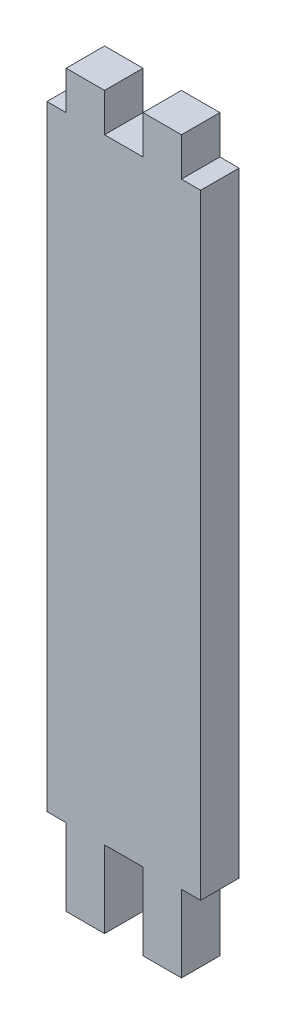
ISO-10303-21;
HEADER;
FILE_DESCRIPTION(('STEP AP214'),'2;1');
FILE_NAME('part.step','',(''),(''),'','','');
FILE_SCHEMA(('AUTOMOTIVE_DESIGN { 1 0 10303 214 1 1 1 1 }'));
ENDSEC;
DATA;
#1=APPLICATION_CONTEXT('core data for automotive mechanical design processes');
#2=APPLICATION_PROTOCOL_DEFINITION('international standard','automotive_design',2000,#1);
#3=PRODUCT_CONTEXT('',#1,'mechanical');
#4=PRODUCT('Part','Part','',(#3));
#5=PRODUCT_RELATED_PRODUCT_CATEGORY('part','',(#4));
#6=PRODUCT_DEFINITION_FORMATION('','',#4);
#7=PRODUCT_DEFINITION_CONTEXT('part definition',#1,'design');
#8=PRODUCT_DEFINITION('design','',#6,#7);
#9=PRODUCT_DEFINITION_SHAPE('','',#8);
#10=(LENGTH_UNIT() NAMED_UNIT(*) SI_UNIT(.MILLI.,.METRE.));
#11=(NAMED_UNIT(*) PLANE_ANGLE_UNIT() SI_UNIT($,.RADIAN.));
#12=(NAMED_UNIT(*) SI_UNIT($,.STERADIAN.) SOLID_ANGLE_UNIT());
#13=UNCERTAINTY_MEASURE_WITH_UNIT(LENGTH_MEASURE(1.E-05),#10,'distance_accuracy_value','');
#14=(GEOMETRIC_REPRESENTATION_CONTEXT(3) GLOBAL_UNCERTAINTY_ASSIGNED_CONTEXT((#13)) GLOBAL_UNIT_ASSIGNED_CONTEXT((#10,
#11,#12)) REPRESENTATION_CONTEXT('',''));
#15=CARTESIAN_POINT('',(0.,0.,0.));
#16=DIRECTION('',(0.,0.,1.));
#17=DIRECTION('',(1.,0.,0.));
#18=AXIS2_PLACEMENT_3D('',#15,#16,#17);
#19=CARTESIAN_POINT('',(7.5,40.,5.));
#20=DIRECTION('',(0.,-1.,0.));
#21=DIRECTION('',(0.,0.,-1.));
#22=AXIS2_PLACEMENT_3D('',#19,#20,#21);
#23=PLANE('',#22);
#24=DIRECTION('',(-1.,0.,0.));
#25=VECTOR('',#24,1.);
#26=CARTESIAN_POINT('',(7.5,40.,0.));
#27=LINE('',#26,#25);
#28=CARTESIAN_POINT('',(10.,40.,0.));
#29=VERTEX_POINT('',#28);
#30=CARTESIAN_POINT('',(7.5,40.,0.));
#31=VERTEX_POINT('',#30);
#32=EDGE_CURVE('E201',#29,#31,#27,.T.);
#33=ORIENTED_EDGE('',*,*,#32,.T.);
#34=DIRECTION('',(0.,0.,-1.));
#35=VECTOR('',#34,1.);
#36=CARTESIAN_POINT('',(7.5,40.,5.));
#37=LINE('',#36,#35);
#38=CARTESIAN_POINT('',(7.5,40.,5.));
#39=VERTEX_POINT('',#38);
#40=EDGE_CURVE('E11',#39,#31,#37,.T.);
#41=ORIENTED_EDGE('',*,*,#40,.F.);
#42=DIRECTION('',(-1.,0.,0.));
#43=VECTOR('',#42,1.);
#44=CARTESIAN_POINT('',(7.5,40.,5.));
#45=LINE('',#44,#43);
#46=CARTESIAN_POINT('',(10.,40.,5.));
#47=VERTEX_POINT('',#46);
#48=EDGE_CURVE('E241',#47,#39,#45,.T.);
#49=ORIENTED_EDGE('',*,*,#48,.F.);
#50=DIRECTION('',(0.,0.,-1.));
#51=VECTOR('',#50,1.);
#52=CARTESIAN_POINT('',(10.,40.,5.));
#53=LINE('',#52,#51);
#54=EDGE_CURVE('E197',#47,#29,#53,.T.);
#55=ORIENTED_EDGE('',*,*,#54,.T.);
#56=EDGE_LOOP('',(#33,#41,#49,#55));
#57=FACE_BOUND('',#56,.T.);
#58=ADVANCED_FACE('F33',(#57),#23,.F.);
#59=CARTESIAN_POINT('',(7.5,45.,5.));
#60=DIRECTION('',(-1.,0.,0.));
#61=DIRECTION('',(0.,0.,1.));
#62=AXIS2_PLACEMENT_3D('',#59,#60,#61);
#63=PLANE('',#62);
#64=DIRECTION('',(0.,1.,0.));
#65=VECTOR('',#64,1.);
#66=CARTESIAN_POINT('',(7.5,45.,0.));
#67=LINE('',#66,#65);
#68=CARTESIAN_POINT('',(7.5,45.,0.));
#69=VERTEX_POINT('',#68);
#70=EDGE_CURVE('E204',#31,#69,#67,.T.);
#71=ORIENTED_EDGE('',*,*,#70,.T.);
#72=DIRECTION('',(0.,0.,-1.));
#73=VECTOR('',#72,1.);
#74=CARTESIAN_POINT('',(7.5,45.,5.));
#75=LINE('',#74,#73);
#76=CARTESIAN_POINT('',(7.5,45.,5.));
#77=VERTEX_POINT('',#76);
#78=EDGE_CURVE('E41',#77,#69,#75,.T.);
#79=ORIENTED_EDGE('',*,*,#78,.F.);
#80=DIRECTION('',(0.,1.,0.));
#81=VECTOR('',#80,1.);
#82=CARTESIAN_POINT('',(7.5,45.,5.));
#83=LINE('',#82,#81);
#84=EDGE_CURVE('E128',#39,#77,#83,.T.);
#85=ORIENTED_EDGE('',*,*,#84,.F.);
#86=ORIENTED_EDGE('',*,*,#40,.T.);
#87=EDGE_LOOP('',(#71,#79,#85,#86));
#88=FACE_BOUND('',#87,.T.);
#89=ADVANCED_FACE('F358',(#88),#63,.F.);
#90=CARTESIAN_POINT('',(2.5,45.,5.));
#91=DIRECTION('',(0.,-1.,0.));
#92=DIRECTION('',(1.,0.,0.));
#93=AXIS2_PLACEMENT_3D('',#90,#91,#92);
#94=PLANE('',#93);
#95=DIRECTION('',(-1.,0.,0.));
#96=VECTOR('',#95,1.);
#97=CARTESIAN_POINT('',(2.5,45.,0.));
#98=LINE('',#97,#96);
#99=CARTESIAN_POINT('',(2.5,45.,0.));
#100=VERTEX_POINT('',#99);
#101=EDGE_CURVE('E206',#69,#100,#98,.T.);
#102=ORIENTED_EDGE('',*,*,#101,.T.);
#103=DIRECTION('',(0.,0.,-1.));
#104=VECTOR('',#103,1.);
#105=CARTESIAN_POINT('',(2.5,45.,5.));
#106=LINE('',#105,#104);
#107=CARTESIAN_POINT('',(2.5,45.,5.));
#108=VERTEX_POINT('',#107);
#109=EDGE_CURVE('E284',#108,#100,#106,.T.);
#110=ORIENTED_EDGE('',*,*,#109,.F.);
#111=DIRECTION('',(-1.,0.,0.));
#112=VECTOR('',#111,1.);
#113=CARTESIAN_POINT('',(2.5,45.,5.));
#114=LINE('',#113,#112);
#115=EDGE_CURVE('E292',#77,#108,#114,.T.);
#116=ORIENTED_EDGE('',*,*,#115,.F.);
#117=ORIENTED_EDGE('',*,*,#78,.T.);
#118=EDGE_LOOP('',(#102,#110,#116,#117));
#119=FACE_BOUND('',#118,.T.);
#120=ADVANCED_FACE('F290',(#119),#94,.F.);
#121=CARTESIAN_POINT('',(2.5,40.,5.));
#122=DIRECTION('',(1.,0.,0.));
#123=DIRECTION('',(0.,0.,-1.));
#124=AXIS2_PLACEMENT_3D('',#121,#122,#123);
#125=PLANE('',#124);
#126=DIRECTION('',(0.,-1.,0.));
#127=VECTOR('',#126,1.);
#128=CARTESIAN_POINT('',(2.5,40.,0.));
#129=LINE('',#128,#127);
#130=CARTESIAN_POINT('',(2.5,40.,0.));
#131=VERTEX_POINT('',#130);
#132=EDGE_CURVE('E208',#100,#131,#129,.T.);
#133=ORIENTED_EDGE('',*,*,#132,.T.);
#134=DIRECTION('',(0.,0.,-1.));
#135=VECTOR('',#134,1.);
#136=CARTESIAN_POINT('',(2.5,40.,5.));
#137=LINE('',#136,#135);
#138=CARTESIAN_POINT('',(2.5,40.,5.));
#139=VERTEX_POINT('',#138);
#140=EDGE_CURVE('E281',#139,#131,#137,.T.);
#141=ORIENTED_EDGE('',*,*,#140,.F.);
#142=DIRECTION('',(0.,-1.,0.));
#143=VECTOR('',#142,1.);
#144=CARTESIAN_POINT('',(2.5,40.,5.));
#145=LINE('',#144,#143);
#146=EDGE_CURVE('E310',#108,#139,#145,.T.);
#147=ORIENTED_EDGE('',*,*,#146,.F.);
#148=ORIENTED_EDGE('',*,*,#109,.T.);
#149=EDGE_LOOP('',(#133,#141,#147,#148));
#150=FACE_BOUND('',#149,.T.);
#151=ADVANCED_FACE('F301',(#150),#125,.F.);
#152=CARTESIAN_POINT('',(-2.5,40.,5.));
#153=DIRECTION('',(0.,-1.,0.));
#154=DIRECTION('',(0.,0.,-1.));
#155=AXIS2_PLACEMENT_3D('',#152,#153,#154);
#156=PLANE('',#155);
#157=DIRECTION('',(-1.,0.,0.));
#158=VECTOR('',#157,1.);
#159=CARTESIAN_POINT('',(-2.5,40.,0.));
#160=LINE('',#159,#158);
#161=CARTESIAN_POINT('',(-2.5,40.,0.));
#162=VERTEX_POINT('',#161);
#163=EDGE_CURVE('E210',#131,#162,#160,.T.);
#164=ORIENTED_EDGE('',*,*,#163,.T.);
#165=DIRECTION('',(0.,0.,-1.));
#166=VECTOR('',#165,1.);
#167=CARTESIAN_POINT('',(-2.5,40.,5.));
#168=LINE('',#167,#166);
#169=CARTESIAN_POINT('',(-2.5,40.,5.));
#170=VERTEX_POINT('',#169);
#171=EDGE_CURVE('E278',#170,#162,#168,.T.);
#172=ORIENTED_EDGE('',*,*,#171,.F.);
#173=DIRECTION('',(-1.,0.,0.));
#174=VECTOR('',#173,1.);
#175=CARTESIAN_POINT('',(-2.5,40.,5.));
#176=LINE('',#175,#174);
#177=EDGE_CURVE('E307',#139,#170,#176,.T.);
#178=ORIENTED_EDGE('',*,*,#177,.F.);
#179=ORIENTED_EDGE('',*,*,#140,.T.);
#180=EDGE_LOOP('',(#164,#172,#178,#179));
#181=FACE_BOUND('',#180,.T.);
#182=ADVANCED_FACE('F305',(#181),#156,.F.);
#183=CARTESIAN_POINT('',(-2.5,45.,5.));
#184=DIRECTION('',(-1.,0.,0.));
#185=DIRECTION('',(0.,0.,1.));
#186=AXIS2_PLACEMENT_3D('',#183,#184,#185);
#187=PLANE('',#186);
#188=DIRECTION('',(0.,1.,0.));
#189=VECTOR('',#188,1.);
#190=CARTESIAN_POINT('',(-2.5,45.,0.));
#191=LINE('',#190,#189);
#192=CARTESIAN_POINT('',(-2.5,45.,0.));
#193=VERTEX_POINT('',#192);
#194=EDGE_CURVE('E212',#162,#193,#191,.T.);
#195=ORIENTED_EDGE('',*,*,#194,.T.);
#196=DIRECTION('',(0.,0.,-1.));
#197=VECTOR('',#196,1.);
#198=CARTESIAN_POINT('',(-2.5,45.,5.));
#199=LINE('',#198,#197);
#200=CARTESIAN_POINT('',(-2.5,45.,5.));
#201=VERTEX_POINT('',#200);
#202=EDGE_CURVE('E275',#201,#193,#199,.T.);
#203=ORIENTED_EDGE('',*,*,#202,.F.);
#204=DIRECTION('',(0.,1.,0.));
#205=VECTOR('',#204,1.);
#206=CARTESIAN_POINT('',(-2.5,45.,5.));
#207=LINE('',#206,#205);
#208=EDGE_CURVE('E309',#170,#201,#207,.T.);
#209=ORIENTED_EDGE('',*,*,#208,.F.);
#210=ORIENTED_EDGE('',*,*,#171,.T.);
#211=EDGE_LOOP('',(#195,#203,#209,#210));
#212=FACE_BOUND('',#211,.T.);
#213=ADVANCED_FACE('F371',(#212),#187,.F.);
#214=CARTESIAN_POINT('',(-7.5,45.,5.));
#215=DIRECTION('',(0.,-1.,0.));
#216=DIRECTION('',(0.,0.,-1.));
#217=AXIS2_PLACEMENT_3D('',#214,#215,#216);
#218=PLANE('',#217);
#219=DIRECTION('',(-1.,0.,0.));
#220=VECTOR('',#219,1.);
#221=CARTESIAN_POINT('',(-7.5,45.,0.));
#222=LINE('',#221,#220);
#223=CARTESIAN_POINT('',(-7.5,45.,0.));
#224=VERTEX_POINT('',#223);
#225=EDGE_CURVE('E214',#193,#224,#222,.T.);
#226=ORIENTED_EDGE('',*,*,#225,.T.);
#227=DIRECTION('',(0.,0.,-1.));
#228=VECTOR('',#227,1.);
#229=CARTESIAN_POINT('',(-7.5,45.,5.));
#230=LINE('',#229,#228);
#231=CARTESIAN_POINT('',(-7.5,45.,5.));
#232=VERTEX_POINT('',#231);
#233=EDGE_CURVE('E272',#232,#224,#230,.T.);
#234=ORIENTED_EDGE('',*,*,#233,.F.);
#235=DIRECTION('',(-1.,0.,0.));
#236=VECTOR('',#235,1.);
#237=CARTESIAN_POINT('',(-7.5,45.,5.));
#238=LINE('',#237,#236);
#239=EDGE_CURVE('E312',#201,#232,#238,.T.);
#240=ORIENTED_EDGE('',*,*,#239,.F.);
#241=ORIENTED_EDGE('',*,*,#202,.T.);
#242=EDGE_LOOP('',(#226,#234,#240,#241));
#243=FACE_BOUND('',#242,.T.);
#244=ADVANCED_FACE('F374',(#243),#218,.F.);
#245=CARTESIAN_POINT('',(-7.5,40.,5.));
#246=DIRECTION('',(1.,0.,0.));
#247=DIRECTION('',(0.,0.,-1.));
#248=AXIS2_PLACEMENT_3D('',#245,#246,#247);
#249=PLANE('',#248);
#250=DIRECTION('',(0.,-1.,0.));
#251=VECTOR('',#250,1.);
#252=CARTESIAN_POINT('',(-7.5,40.,0.));
#253=LINE('',#252,#251);
#254=CARTESIAN_POINT('',(-7.5,40.,0.));
#255=VERTEX_POINT('',#254);
#256=EDGE_CURVE('E216',#224,#255,#253,.T.);
#257=ORIENTED_EDGE('',*,*,#256,.T.);
#258=DIRECTION('',(0.,0.,-1.));
#259=VECTOR('',#258,1.);
#260=CARTESIAN_POINT('',(-7.5,40.,5.));
#261=LINE('',#260,#259);
#262=CARTESIAN_POINT('',(-7.5,40.,5.));
#263=VERTEX_POINT('',#262);
#264=EDGE_CURVE('E269',#263,#255,#261,.T.);
#265=ORIENTED_EDGE('',*,*,#264,.F.);
#266=DIRECTION('',(0.,-1.,0.));
#267=VECTOR('',#266,1.);
#268=CARTESIAN_POINT('',(-7.5,40.,5.));
#269=LINE('',#268,#267);
#270=EDGE_CURVE('E318',#232,#263,#269,.T.);
#271=ORIENTED_EDGE('',*,*,#270,.F.);
#272=ORIENTED_EDGE('',*,*,#233,.T.);
#273=EDGE_LOOP('',(#257,#265,#271,#272));
#274=FACE_BOUND('',#273,.T.);
#275=ADVANCED_FACE('F378',(#274),#249,.F.);
#276=CARTESIAN_POINT('',(-10.,40.,5.));
#277=DIRECTION('',(0.,-1.,0.));
#278=DIRECTION('',(0.,0.,-1.));
#279=AXIS2_PLACEMENT_3D('',#276,#277,#278);
#280=PLANE('',#279);
#281=DIRECTION('',(-1.,0.,0.));
#282=VECTOR('',#281,1.);
#283=CARTESIAN_POINT('',(-10.,40.,0.));
#284=LINE('',#283,#282);
#285=CARTESIAN_POINT('',(-10.,40.,0.));
#286=VERTEX_POINT('',#285);
#287=EDGE_CURVE('E218',#255,#286,#284,.T.);
#288=ORIENTED_EDGE('',*,*,#287,.T.);
#289=DIRECTION('',(0.,0.,-1.));
#290=VECTOR('',#289,1.);
#291=CARTESIAN_POINT('',(-10.,40.,5.));
#292=LINE('',#291,#290);
#293=CARTESIAN_POINT('',(-10.,40.,5.));
#294=VERTEX_POINT('',#293);
#295=EDGE_CURVE('E266',#294,#286,#292,.T.);
#296=ORIENTED_EDGE('',*,*,#295,.F.);
#297=DIRECTION('',(-1.,0.,0.));
#298=VECTOR('',#297,1.);
#299=CARTESIAN_POINT('',(-10.,40.,5.));
#300=LINE('',#299,#298);
#301=EDGE_CURVE('E320',#263,#294,#300,.T.);
#302=ORIENTED_EDGE('',*,*,#301,.F.);
#303=ORIENTED_EDGE('',*,*,#264,.T.);
#304=EDGE_LOOP('',(#288,#296,#302,#303));
#305=FACE_BOUND('',#304,.T.);
#306=ADVANCED_FACE('F382',(#305),#280,.F.);
#307=CARTESIAN_POINT('',(-10.,-40.,5.));
#308=DIRECTION('',(1.,0.,0.));
#309=DIRECTION('',(0.,0.,-1.));
#310=AXIS2_PLACEMENT_3D('',#307,#308,#309);
#311=PLANE('',#310);
#312=DIRECTION('',(0.,-1.,0.));
#313=VECTOR('',#312,1.);
#314=CARTESIAN_POINT('',(-10.,-40.,0.));
#315=LINE('',#314,#313);
#316=CARTESIAN_POINT('',(-10.,-40.,0.));
#317=VERTEX_POINT('',#316);
#318=EDGE_CURVE('E220',#286,#317,#315,.T.);
#319=ORIENTED_EDGE('',*,*,#318,.T.);
#320=DIRECTION('',(0.,0.,-1.));
#321=VECTOR('',#320,1.);
#322=CARTESIAN_POINT('',(-10.,-40.,5.));
#323=LINE('',#322,#321);
#324=CARTESIAN_POINT('',(-10.,-40.,5.));
#325=VERTEX_POINT('',#324);
#326=EDGE_CURVE('E263',#325,#317,#323,.T.);
#327=ORIENTED_EDGE('',*,*,#326,.F.);
#328=DIRECTION('',(0.,-1.,0.));
#329=VECTOR('',#328,1.);
#330=CARTESIAN_POINT('',(-10.,-40.,5.));
#331=LINE('',#330,#329);
#332=EDGE_CURVE('E322',#294,#325,#331,.T.);
#333=ORIENTED_EDGE('',*,*,#332,.F.);
#334=ORIENTED_EDGE('',*,*,#295,.T.);
#335=EDGE_LOOP('',(#319,#327,#333,#334));
#336=FACE_BOUND('',#335,.T.);
#337=ADVANCED_FACE('F386',(#336),#311,.F.);
#338=CARTESIAN_POINT('',(-10.,-40.,5.));
#339=DIRECTION('',(0.,1.,0.));
#340=DIRECTION('',(0.,0.,1.));
#341=AXIS2_PLACEMENT_3D('',#338,#339,#340);
#342=PLANE('',#341);
#343=DIRECTION('',(1.,0.,0.));
#344=VECTOR('',#343,1.);
#345=CARTESIAN_POINT('',(-10.,-40.,0.));
#346=LINE('',#345,#344);
#347=CARTESIAN_POINT('',(-7.5,-40.,0.));
#348=VERTEX_POINT('',#347);
#349=EDGE_CURVE('E222',#317,#348,#346,.T.);
#350=ORIENTED_EDGE('',*,*,#349,.T.);
#351=DIRECTION('',(0.,0.,-1.));
#352=VECTOR('',#351,1.);
#353=CARTESIAN_POINT('',(-7.5,-40.,5.));
#354=LINE('',#353,#352);
#355=CARTESIAN_POINT('',(-7.5,-40.,5.));
#356=VERTEX_POINT('',#355);
#357=EDGE_CURVE('E260',#356,#348,#354,.T.);
#358=ORIENTED_EDGE('',*,*,#357,.F.);
#359=DIRECTION('',(1.,0.,0.));
#360=VECTOR('',#359,1.);
#361=CARTESIAN_POINT('',(-10.,-40.,5.));
#362=LINE('',#361,#360);
#363=EDGE_CURVE('E324',#325,#356,#362,.T.);
#364=ORIENTED_EDGE('',*,*,#363,.F.);
#365=ORIENTED_EDGE('',*,*,#326,.T.);
#366=EDGE_LOOP('',(#350,#358,#364,#365));
#367=FACE_BOUND('',#366,.T.);
#368=ADVANCED_FACE('F390',(#367),#342,.F.);
#369=CARTESIAN_POINT('',(-7.5,-45.,5.));
#370=DIRECTION('',(1.,0.,0.));
#371=DIRECTION('',(0.,0.,-1.));
#372=AXIS2_PLACEMENT_3D('',#369,#370,#371);
#373=PLANE('',#372);
#374=DIRECTION('',(0.,-1.,0.));
#375=VECTOR('',#374,1.);
#376=CARTESIAN_POINT('',(-7.5,-45.,0.));
#377=LINE('',#376,#375);
#378=CARTESIAN_POINT('',(-7.5,-50.,0.));
#379=VERTEX_POINT('',#378);
#380=EDGE_CURVE('E225',#348,#379,#377,.T.);
#381=ORIENTED_EDGE('',*,*,#380,.T.);
#382=DIRECTION('',(0.,0.,-1.));
#383=VECTOR('',#382,1.);
#384=CARTESIAN_POINT('',(-7.5,-50.,5.));
#385=LINE('',#384,#383);
#386=CARTESIAN_POINT('',(-7.5,-50.,5.));
#387=VERTEX_POINT('',#386);
#388=EDGE_CURVE('E257',#387,#379,#385,.T.);
#389=ORIENTED_EDGE('',*,*,#388,.F.);
#390=DIRECTION('',(0.,-1.,0.));
#391=VECTOR('',#390,1.);
#392=CARTESIAN_POINT('',(-7.5,-40.,5.));
#393=LINE('',#392,#391);
#394=EDGE_CURVE('E326',#356,#387,#393,.T.);
#395=ORIENTED_EDGE('',*,*,#394,.F.);
#396=ORIENTED_EDGE('',*,*,#357,.T.);
#397=EDGE_LOOP('',(#381,#389,#395,#396));
#398=FACE_BOUND('',#397,.T.);
#399=ADVANCED_FACE('F394',(#398),#373,.F.);
#400=CARTESIAN_POINT('',(-7.5,-50.,5.));
#401=DIRECTION('',(0.,1.,0.));
#402=DIRECTION('',(0.,0.,1.));
#403=AXIS2_PLACEMENT_3D('',#400,#401,#402);
#404=PLANE('',#403);
#405=DIRECTION('',(1.,0.,0.));
#406=VECTOR('',#405,1.);
#407=CARTESIAN_POINT('',(-7.5,-50.,0.));
#408=LINE('',#407,#406);
#409=CARTESIAN_POINT('',(-2.5,-50.,0.));
#410=VERTEX_POINT('',#409);
#411=EDGE_CURVE('E227',#379,#410,#408,.T.);
#412=ORIENTED_EDGE('',*,*,#411,.T.);
#413=DIRECTION('',(0.,0.,-1.));
#414=VECTOR('',#413,1.);
#415=CARTESIAN_POINT('',(-2.5,-50.,5.));
#416=LINE('',#415,#414);
#417=CARTESIAN_POINT('',(-2.5,-50.,5.));
#418=VERTEX_POINT('',#417);
#419=EDGE_CURVE('E254',#418,#410,#416,.T.);
#420=ORIENTED_EDGE('',*,*,#419,.F.);
#421=DIRECTION('',(1.,0.,0.));
#422=VECTOR('',#421,1.);
#423=CARTESIAN_POINT('',(-7.5,-50.,5.));
#424=LINE('',#423,#422);
#425=EDGE_CURVE('E328',#387,#418,#424,.T.);
#426=ORIENTED_EDGE('',*,*,#425,.F.);
#427=ORIENTED_EDGE('',*,*,#388,.T.);
#428=EDGE_LOOP('',(#412,#420,#426,#427));
#429=FACE_BOUND('',#428,.T.);
#430=ADVANCED_FACE('F398',(#429),#404,.F.);
#431=CARTESIAN_POINT('',(-2.5,-50.,5.));
#432=DIRECTION('',(-1.,0.,0.));
#433=DIRECTION('',(0.,-1.,0.));
#434=AXIS2_PLACEMENT_3D('',#431,#432,#433);
#435=PLANE('',#434);
#436=DIRECTION('',(0.,1.,0.));
#437=VECTOR('',#436,1.);
#438=CARTESIAN_POINT('',(-2.5,-50.,0.));
#439=LINE('',#438,#437);
#440=CARTESIAN_POINT('',(-2.5,-40.,0.));
#441=VERTEX_POINT('',#440);
#442=EDGE_CURVE('E229',#410,#441,#439,.T.);
#443=ORIENTED_EDGE('',*,*,#442,.T.);
#444=DIRECTION('',(0.,0.,-1.));
#445=VECTOR('',#444,1.);
#446=CARTESIAN_POINT('',(-2.5,-40.,5.));
#447=LINE('',#446,#445);
#448=CARTESIAN_POINT('',(-2.5,-40.,5.));
#449=VERTEX_POINT('',#448);
#450=EDGE_CURVE('E251',#449,#441,#447,.T.);
#451=ORIENTED_EDGE('',*,*,#450,.F.);
#452=DIRECTION('',(0.,1.,0.));
#453=VECTOR('',#452,1.);
#454=CARTESIAN_POINT('',(-2.5,-50.,5.));
#455=LINE('',#454,#453);
#456=EDGE_CURVE('E330',#418,#449,#455,.T.);
#457=ORIENTED_EDGE('',*,*,#456,.F.);
#458=ORIENTED_EDGE('',*,*,#419,.T.);
#459=EDGE_LOOP('',(#443,#451,#457,#458));
#460=FACE_BOUND('',#459,.T.);
#461=ADVANCED_FACE('F402',(#460),#435,.F.);
#462=CARTESIAN_POINT('',(-2.5,-40.,5.));
#463=DIRECTION('',(0.,1.,0.));
#464=DIRECTION('',(0.,0.,1.));
#465=AXIS2_PLACEMENT_3D('',#462,#463,#464);
#466=PLANE('',#465);
#467=DIRECTION('',(1.,0.,0.));
#468=VECTOR('',#467,1.);
#469=CARTESIAN_POINT('',(-2.5,-40.,0.));
#470=LINE('',#469,#468);
#471=CARTESIAN_POINT('',(2.5,-40.,0.));
#472=VERTEX_POINT('',#471);
#473=EDGE_CURVE('E231',#441,#472,#470,.T.);
#474=ORIENTED_EDGE('',*,*,#473,.T.);
#475=DIRECTION('',(0.,0.,-1.));
#476=VECTOR('',#475,1.);
#477=CARTESIAN_POINT('',(2.5,-40.,5.));
#478=LINE('',#477,#476);
#479=CARTESIAN_POINT('',(2.5,-40.,5.));
#480=VERTEX_POINT('',#479);
#481=EDGE_CURVE('E248',#480,#472,#478,.T.);
#482=ORIENTED_EDGE('',*,*,#481,.F.);
#483=DIRECTION('',(1.,0.,0.));
#484=VECTOR('',#483,1.);
#485=CARTESIAN_POINT('',(-2.5,-40.,5.));
#486=LINE('',#485,#484);
#487=EDGE_CURVE('E332',#449,#480,#486,.T.);
#488=ORIENTED_EDGE('',*,*,#487,.F.);
#489=ORIENTED_EDGE('',*,*,#450,.T.);
#490=EDGE_LOOP('',(#474,#482,#488,#489));
#491=FACE_BOUND('',#490,.T.);
#492=ADVANCED_FACE('F406',(#491),#466,.F.);
#493=CARTESIAN_POINT('',(2.5,-45.,5.));
#494=DIRECTION('',(1.,0.,0.));
#495=DIRECTION('',(0.,1.,0.));
#496=AXIS2_PLACEMENT_3D('',#493,#494,#495);
#497=PLANE('',#496);
#498=DIRECTION('',(0.,-1.,0.));
#499=VECTOR('',#498,1.);
#500=CARTESIAN_POINT('',(2.5,-45.,0.));
#501=LINE('',#500,#499);
#502=CARTESIAN_POINT('',(2.5,-50.,0.));
#503=VERTEX_POINT('',#502);
#504=EDGE_CURVE('E234',#472,#503,#501,.T.);
#505=ORIENTED_EDGE('',*,*,#504,.T.);
#506=DIRECTION('',(0.,0.,-1.));
#507=VECTOR('',#506,1.);
#508=CARTESIAN_POINT('',(2.5,-50.,5.));
#509=LINE('',#508,#507);
#510=CARTESIAN_POINT('',(2.5,-50.,5.));
#511=VERTEX_POINT('',#510);
#512=EDGE_CURVE('E245',#511,#503,#509,.T.);
#513=ORIENTED_EDGE('',*,*,#512,.F.);
#514=DIRECTION('',(0.,-1.,0.));
#515=VECTOR('',#514,1.);
#516=CARTESIAN_POINT('',(2.5,-40.,5.));
#517=LINE('',#516,#515);
#518=EDGE_CURVE('E334',#480,#511,#517,.T.);
#519=ORIENTED_EDGE('',*,*,#518,.F.);
#520=ORIENTED_EDGE('',*,*,#481,.T.);
#521=EDGE_LOOP('',(#505,#513,#519,#520));
#522=FACE_BOUND('',#521,.T.);
#523=ADVANCED_FACE('F340',(#522),#497,.F.);
#524=CARTESIAN_POINT('',(2.5,-50.,5.));
#525=DIRECTION('',(0.,1.,0.));
#526=DIRECTION('',(0.,0.,1.));
#527=AXIS2_PLACEMENT_3D('',#524,#525,#526);
#528=PLANE('',#527);
#529=DIRECTION('',(1.,0.,0.));
#530=VECTOR('',#529,1.);
#531=CARTESIAN_POINT('',(2.5,-50.,0.));
#532=LINE('',#531,#530);
#533=CARTESIAN_POINT('',(7.5,-50.,0.));
#534=VERTEX_POINT('',#533);
#535=EDGE_CURVE('E236',#503,#534,#532,.T.);
#536=ORIENTED_EDGE('',*,*,#535,.T.);
#537=DIRECTION('',(0.,0.,-1.));
#538=VECTOR('',#537,1.);
#539=CARTESIAN_POINT('',(7.5,-50.,5.));
#540=LINE('',#539,#538);
#541=CARTESIAN_POINT('',(7.5,-50.,5.));
#542=VERTEX_POINT('',#541);
#543=EDGE_CURVE('E192',#542,#534,#540,.T.);
#544=ORIENTED_EDGE('',*,*,#543,.F.);
#545=DIRECTION('',(1.,0.,0.));
#546=VECTOR('',#545,1.);
#547=CARTESIAN_POINT('',(2.5,-50.,5.));
#548=LINE('',#547,#546);
#549=EDGE_CURVE('E183',#511,#542,#548,.T.);
#550=ORIENTED_EDGE('',*,*,#549,.F.);
#551=ORIENTED_EDGE('',*,*,#512,.T.);
#552=EDGE_LOOP('',(#536,#544,#550,#551));
#553=FACE_BOUND('',#552,.T.);
#554=ADVANCED_FACE('F343',(#553),#528,.F.);
#555=CARTESIAN_POINT('',(7.5,-50.,5.));
#556=DIRECTION('',(-1.,0.,0.));
#557=DIRECTION('',(0.,0.,1.));
#558=AXIS2_PLACEMENT_3D('',#555,#556,#557);
#559=PLANE('',#558);
#560=DIRECTION('',(0.,1.,0.));
#561=VECTOR('',#560,1.);
#562=CARTESIAN_POINT('',(7.5,-50.,0.));
#563=LINE('',#562,#561);
#564=CARTESIAN_POINT('',(7.5,-40.,0.));
#565=VERTEX_POINT('',#564);
#566=EDGE_CURVE('E191',#534,#565,#563,.T.);
#567=ORIENTED_EDGE('',*,*,#566,.T.);
#568=DIRECTION('',(0.,0.,-1.));
#569=VECTOR('',#568,1.);
#570=CARTESIAN_POINT('',(7.5,-40.,5.));
#571=LINE('',#570,#569);
#572=CARTESIAN_POINT('',(7.5,-40.,5.));
#573=VERTEX_POINT('',#572);
#574=EDGE_CURVE('E188',#573,#565,#571,.T.);
#575=ORIENTED_EDGE('',*,*,#574,.F.);
#576=DIRECTION('',(0.,1.,0.));
#577=VECTOR('',#576,1.);
#578=CARTESIAN_POINT('',(7.5,-50.,5.));
#579=LINE('',#578,#577);
#580=EDGE_CURVE('E177',#542,#573,#579,.T.);
#581=ORIENTED_EDGE('',*,*,#580,.F.);
#582=ORIENTED_EDGE('',*,*,#543,.T.);
#583=EDGE_LOOP('',(#567,#575,#581,#582));
#584=FACE_BOUND('',#583,.T.);
#585=ADVANCED_FACE('F189',(#584),#559,.F.);
#586=CARTESIAN_POINT('',(7.5,-40.,5.));
#587=DIRECTION('',(0.,1.,0.));
#588=DIRECTION('',(0.,0.,1.));
#589=AXIS2_PLACEMENT_3D('',#586,#587,#588);
#590=PLANE('',#589);
#591=DIRECTION('',(1.,0.,0.));
#592=VECTOR('',#591,1.);
#593=CARTESIAN_POINT('',(7.5,-40.,0.));
#594=LINE('',#593,#592);
#595=CARTESIAN_POINT('',(10.,-40.,0.));
#596=VERTEX_POINT('',#595);
#597=EDGE_CURVE('E114',#565,#596,#594,.T.);
#598=ORIENTED_EDGE('',*,*,#597,.T.);
#599=DIRECTION('',(0.,0.,-1.));
#600=VECTOR('',#599,1.);
#601=CARTESIAN_POINT('',(10.,-40.,5.));
#602=LINE('',#601,#600);
#603=CARTESIAN_POINT('',(10.,-40.,5.));
#604=VERTEX_POINT('',#603);
#605=EDGE_CURVE('E193',#604,#596,#602,.T.);
#606=ORIENTED_EDGE('',*,*,#605,.F.);
#607=DIRECTION('',(1.,0.,0.));
#608=VECTOR('',#607,1.);
#609=CARTESIAN_POINT('',(7.5,-40.,5.));
#610=LINE('',#609,#608);
#611=EDGE_CURVE('E181',#573,#604,#610,.T.);
#612=ORIENTED_EDGE('',*,*,#611,.F.);
#613=ORIENTED_EDGE('',*,*,#574,.T.);
#614=EDGE_LOOP('',(#598,#606,#612,#613));
#615=FACE_BOUND('',#614,.T.);
#616=ADVANCED_FACE('F195',(#615),#590,.F.);
#617=CARTESIAN_POINT('',(10.,-40.,5.));
#618=DIRECTION('',(-1.,0.,0.));
#619=DIRECTION('',(0.,0.,1.));
#620=AXIS2_PLACEMENT_3D('',#617,#618,#619);
#621=PLANE('',#620);
#622=DIRECTION('',(0.,1.,0.));
#623=VECTOR('',#622,1.);
#624=CARTESIAN_POINT('',(10.,-40.,0.));
#625=LINE('',#624,#623);
#626=EDGE_CURVE('E120',#596,#29,#625,.T.);
#627=ORIENTED_EDGE('',*,*,#626,.T.);
#628=ORIENTED_EDGE('',*,*,#54,.F.);
#629=DIRECTION('',(0.,1.,0.));
#630=VECTOR('',#629,1.);
#631=CARTESIAN_POINT('',(10.,-40.,5.));
#632=LINE('',#631,#630);
#633=EDGE_CURVE('E49',#604,#47,#632,.T.);
#634=ORIENTED_EDGE('',*,*,#633,.F.);
#635=ORIENTED_EDGE('',*,*,#605,.T.);
#636=EDGE_LOOP('',(#627,#628,#634,#635));
#637=FACE_BOUND('',#636,.T.);
#638=ADVANCED_FACE('F347',(#637),#621,.F.);
#639=CARTESIAN_POINT('',(0.,0.,5.));
#640=DIRECTION('',(0.,0.,1.));
#641=DIRECTION('',(1.,0.,0.));
#642=AXIS2_PLACEMENT_3D('',#639,#640,#641);
#643=PLANE('',#642);
#644=ORIENTED_EDGE('',*,*,#48,.T.);
#645=ORIENTED_EDGE('',*,*,#84,.T.);
#646=ORIENTED_EDGE('',*,*,#115,.T.);
#647=ORIENTED_EDGE('',*,*,#146,.T.);
#648=ORIENTED_EDGE('',*,*,#177,.T.);
#649=ORIENTED_EDGE('',*,*,#208,.T.);
#650=ORIENTED_EDGE('',*,*,#239,.T.);
#651=ORIENTED_EDGE('',*,*,#270,.T.);
#652=ORIENTED_EDGE('',*,*,#301,.T.);
#653=ORIENTED_EDGE('',*,*,#332,.T.);
#654=ORIENTED_EDGE('',*,*,#363,.T.);
#655=ORIENTED_EDGE('',*,*,#394,.T.);
#656=ORIENTED_EDGE('',*,*,#425,.T.);
#657=ORIENTED_EDGE('',*,*,#456,.T.);
#658=ORIENTED_EDGE('',*,*,#487,.T.);
#659=ORIENTED_EDGE('',*,*,#518,.T.);
#660=ORIENTED_EDGE('',*,*,#549,.T.);
#661=ORIENTED_EDGE('',*,*,#580,.T.);
#662=ORIENTED_EDGE('',*,*,#611,.T.);
#663=ORIENTED_EDGE('',*,*,#633,.T.);
#664=EDGE_LOOP('',(#644,#645,#646,#647,#648,#649,#650,#651,#652,#653,#654,#655,#656,#657,#658,
#659,#660,#661,#662,#663));
#665=FACE_BOUND('',#664,.T.);
#666=ADVANCED_FACE('F179',(#665),#643,.T.);
#667=CARTESIAN_POINT('',(0.,0.,0.));
#668=DIRECTION('',(0.,0.,1.));
#669=DIRECTION('',(1.,0.,0.));
#670=AXIS2_PLACEMENT_3D('',#667,#668,#669);
#671=PLANE('',#670);
#672=ORIENTED_EDGE('',*,*,#32,.F.);
#673=ORIENTED_EDGE('',*,*,#626,.F.);
#674=ORIENTED_EDGE('',*,*,#597,.F.);
#675=ORIENTED_EDGE('',*,*,#566,.F.);
#676=ORIENTED_EDGE('',*,*,#535,.F.);
#677=ORIENTED_EDGE('',*,*,#504,.F.);
#678=ORIENTED_EDGE('',*,*,#473,.F.);
#679=ORIENTED_EDGE('',*,*,#442,.F.);
#680=ORIENTED_EDGE('',*,*,#411,.F.);
#681=ORIENTED_EDGE('',*,*,#380,.F.);
#682=ORIENTED_EDGE('',*,*,#349,.F.);
#683=ORIENTED_EDGE('',*,*,#318,.F.);
#684=ORIENTED_EDGE('',*,*,#287,.F.);
#685=ORIENTED_EDGE('',*,*,#256,.F.);
#686=ORIENTED_EDGE('',*,*,#225,.F.);
#687=ORIENTED_EDGE('',*,*,#194,.F.);
#688=ORIENTED_EDGE('',*,*,#163,.F.);
#689=ORIENTED_EDGE('',*,*,#132,.F.);
#690=ORIENTED_EDGE('',*,*,#101,.F.);
#691=ORIENTED_EDGE('',*,*,#70,.F.);
#692=EDGE_LOOP('',(#672,#673,#674,#675,#676,#677,#678,#679,#680,#681,#682,#683,#684,#685,#686,
#687,#688,#689,#690,#691));
#693=FACE_BOUND('',#692,.T.);
#694=ADVANCED_FACE('F296',(#693),#671,.F.);
#695=CLOSED_SHELL('',(#58,#89,#120,#151,#182,#213,#244,#275,#306,#337,#368,#399,#430,#461,#492,
#523,#554,#585,#616,#638,#666,#694));
#696=MANIFOLD_SOLID_BREP('B2',#695);
#697=ADVANCED_BREP_SHAPE_REPRESENTATION('',(#18,#696),#14);
#698=SHAPE_DEFINITION_REPRESENTATION(#9,#697);
ENDSEC;
END-ISO-10303-21;
